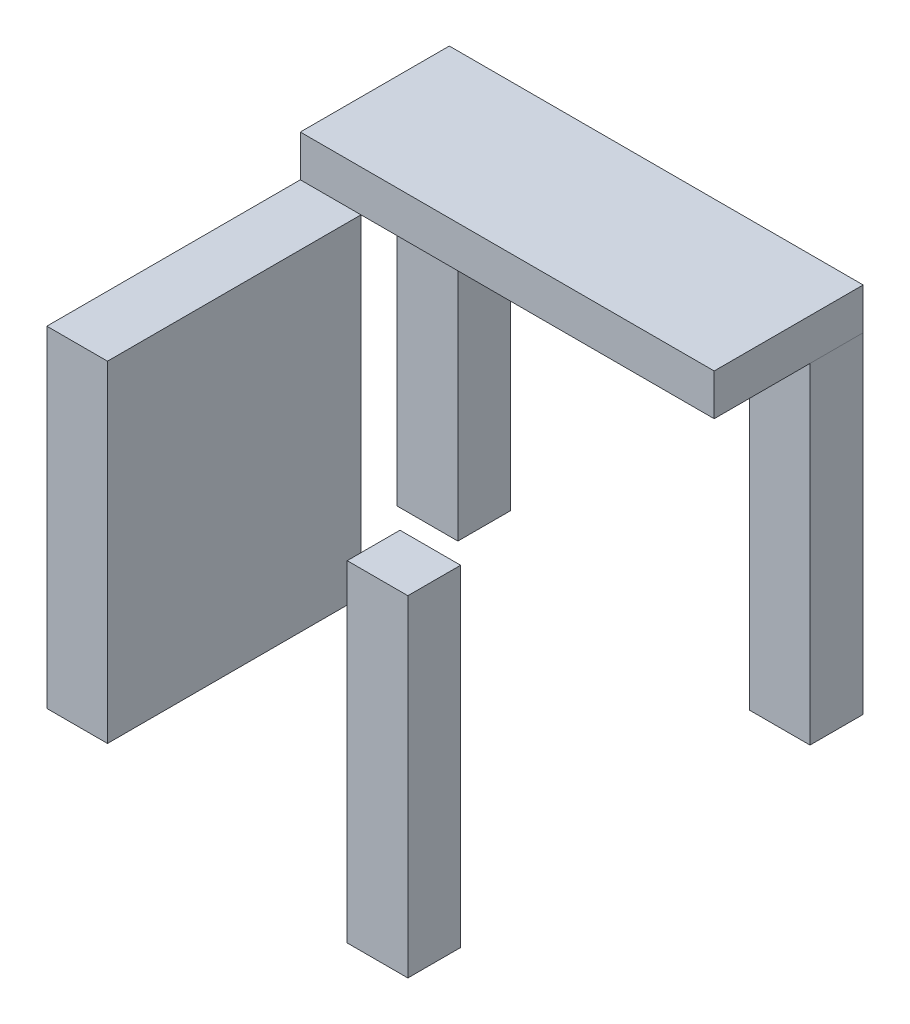
ISO-10303-21;
HEADER;
FILE_DESCRIPTION(('STEP AP214'),'2;1');
FILE_NAME('part.step','',(''),(''),'','','');
FILE_SCHEMA(('AUTOMOTIVE_DESIGN { 1 0 10303 214 1 1 1 1 }'));
ENDSEC;
DATA;
#1=APPLICATION_CONTEXT('core data for automotive mechanical design processes');
#2=APPLICATION_PROTOCOL_DEFINITION('international standard','automotive_design',2000,#1);
#3=PRODUCT_CONTEXT('',#1,'mechanical');
#4=PRODUCT('Part','Part','',(#3));
#5=PRODUCT_RELATED_PRODUCT_CATEGORY('part','',(#4));
#6=PRODUCT_DEFINITION_FORMATION('','',#4);
#7=PRODUCT_DEFINITION_CONTEXT('part definition',#1,'design');
#8=PRODUCT_DEFINITION('design','',#6,#7);
#9=PRODUCT_DEFINITION_SHAPE('','',#8);
#10=(LENGTH_UNIT() NAMED_UNIT(*) SI_UNIT(.MILLI.,.METRE.));
#11=(NAMED_UNIT(*) PLANE_ANGLE_UNIT() SI_UNIT($,.RADIAN.));
#12=(NAMED_UNIT(*) SI_UNIT($,.STERADIAN.) SOLID_ANGLE_UNIT());
#13=UNCERTAINTY_MEASURE_WITH_UNIT(LENGTH_MEASURE(1.E-05),#10,'distance_accuracy_value','');
#14=(GEOMETRIC_REPRESENTATION_CONTEXT(3) GLOBAL_UNCERTAINTY_ASSIGNED_CONTEXT((#13)) GLOBAL_UNIT_ASSIGNED_CONTEXT((#10,
#11,#12)) REPRESENTATION_CONTEXT('',''));
#15=CARTESIAN_POINT('',(0.,0.,0.));
#16=DIRECTION('',(0.,0.,1.));
#17=DIRECTION('',(1.,0.,0.));
#18=AXIS2_PLACEMENT_3D('',#15,#16,#17);
#19=CARTESIAN_POINT('',(85.36181093433,-80.,110.034688240795));
#20=DIRECTION('',(1.,0.,0.));
#21=DIRECTION('',(0.,0.,-1.));
#22=AXIS2_PLACEMENT_3D('',#19,#20,#21);
#23=PLANE('',#22);
#24=DIRECTION('',(0.,0.,-1.));
#25=VECTOR('',#24,1.);
#26=CARTESIAN_POINT('',(85.36181093433,0.,110.034688240795));
#27=LINE('',#26,#25);
#28=CARTESIAN_POINT('',(85.36181093433,0.,110.034688240795));
#29=VERTEX_POINT('',#28);
#30=CARTESIAN_POINT('',(85.36181093433,0.,97.2842820171065));
#31=VERTEX_POINT('',#30);
#32=EDGE_CURVE('E107',#29,#31,#27,.T.);
#33=ORIENTED_EDGE('',*,*,#32,.T.);
#34=DIRECTION('',(0.,1.,0.));
#35=VECTOR('',#34,1.);
#36=CARTESIAN_POINT('',(85.36181093433,-80.,97.2842820171065));
#37=LINE('',#36,#35);
#38=CARTESIAN_POINT('',(85.36181093433,-80.,97.2842820171065));
#39=VERTEX_POINT('',#38);
#40=EDGE_CURVE('E12',#39,#31,#37,.T.);
#41=ORIENTED_EDGE('',*,*,#40,.F.);
#42=DIRECTION('',(0.,0.,-1.));
#43=VECTOR('',#42,1.);
#44=CARTESIAN_POINT('',(85.36181093433,-80.,110.034688240795));
#45=LINE('',#44,#43);
#46=CARTESIAN_POINT('',(85.36181093433,-80.,110.034688240795));
#47=VERTEX_POINT('',#46);
#48=EDGE_CURVE('E95',#47,#39,#45,.T.);
#49=ORIENTED_EDGE('',*,*,#48,.F.);
#50=DIRECTION('',(0.,1.,0.));
#51=VECTOR('',#50,1.);
#52=CARTESIAN_POINT('',(85.36181093433,-80.,110.034688240795));
#53=LINE('',#52,#51);
#54=EDGE_CURVE('E103',#47,#29,#53,.T.);
#55=ORIENTED_EDGE('',*,*,#54,.T.);
#56=EDGE_LOOP('',(#33,#41,#49,#55));
#57=FACE_BOUND('',#56,.T.);
#58=ADVANCED_FACE('F44',(#57),#23,.F.);
#59=CARTESIAN_POINT('',(85.36181093433,-80.,97.2842820171065));
#60=DIRECTION('',(0.,0.,1.));
#61=DIRECTION('',(1.,0.,0.));
#62=AXIS2_PLACEMENT_3D('',#59,#60,#61);
#63=PLANE('',#62);
#64=DIRECTION('',(1.,0.,0.));
#65=VECTOR('',#64,1.);
#66=CARTESIAN_POINT('',(85.36181093433,0.,97.2842820171065));
#67=LINE('',#66,#65);
#68=CARTESIAN_POINT('',(100.019107271016,0.,97.2842820171065));
#69=VERTEX_POINT('',#68);
#70=EDGE_CURVE('E99',#31,#69,#67,.T.);
#71=ORIENTED_EDGE('',*,*,#70,.T.);
#72=DIRECTION('',(0.,1.,0.));
#73=VECTOR('',#72,1.);
#74=CARTESIAN_POINT('',(100.019107271016,-80.,97.2842820171065));
#75=LINE('',#74,#73);
#76=CARTESIAN_POINT('',(100.019107271016,-80.,97.2842820171065));
#77=VERTEX_POINT('',#76);
#78=EDGE_CURVE('E52',#77,#69,#75,.T.);
#79=ORIENTED_EDGE('',*,*,#78,.F.);
#80=DIRECTION('',(1.,0.,0.));
#81=VECTOR('',#80,1.);
#82=CARTESIAN_POINT('',(85.36181093433,-80.,97.2842820171065));
#83=LINE('',#82,#81);
#84=EDGE_CURVE('E90',#39,#77,#83,.T.);
#85=ORIENTED_EDGE('',*,*,#84,.F.);
#86=ORIENTED_EDGE('',*,*,#40,.T.);
#87=EDGE_LOOP('',(#71,#79,#85,#86));
#88=FACE_BOUND('',#87,.T.);
#89=ADVANCED_FACE('F98',(#88),#63,.F.);
#90=CARTESIAN_POINT('',(100.019107271016,-80.,110.034688240795));
#91=DIRECTION('',(-1.,0.,0.));
#92=DIRECTION('',(0.,0.,1.));
#93=AXIS2_PLACEMENT_3D('',#90,#91,#92);
#94=PLANE('',#93);
#95=DIRECTION('',(0.,0.,1.));
#96=VECTOR('',#95,1.);
#97=CARTESIAN_POINT('',(100.019107271016,0.,110.034688240795));
#98=LINE('',#97,#96);
#99=CARTESIAN_POINT('',(100.019107271016,0.,110.034688240795));
#100=VERTEX_POINT('',#99);
#101=EDGE_CURVE('E77',#69,#100,#98,.T.);
#102=ORIENTED_EDGE('',*,*,#101,.T.);
#103=DIRECTION('',(0.,1.,0.));
#104=VECTOR('',#103,1.);
#105=CARTESIAN_POINT('',(100.019107271016,-80.,110.034688240795));
#106=LINE('',#105,#104);
#107=CARTESIAN_POINT('',(100.019107271016,-80.,110.034688240795));
#108=VERTEX_POINT('',#107);
#109=EDGE_CURVE('E100',#108,#100,#106,.T.);
#110=ORIENTED_EDGE('',*,*,#109,.F.);
#111=DIRECTION('',(0.,0.,1.));
#112=VECTOR('',#111,1.);
#113=CARTESIAN_POINT('',(100.019107271016,-80.,110.034688240795));
#114=LINE('',#113,#112);
#115=EDGE_CURVE('E93',#77,#108,#114,.T.);
#116=ORIENTED_EDGE('',*,*,#115,.F.);
#117=ORIENTED_EDGE('',*,*,#78,.T.);
#118=EDGE_LOOP('',(#102,#110,#116,#117));
#119=FACE_BOUND('',#118,.T.);
#120=ADVANCED_FACE('F101',(#119),#94,.F.);
#121=CARTESIAN_POINT('',(85.36181093433,-80.,110.034688240795));
#122=DIRECTION('',(0.,0.,-1.));
#123=DIRECTION('',(-1.,0.,0.));
#124=AXIS2_PLACEMENT_3D('',#121,#122,#123);
#125=PLANE('',#124);
#126=DIRECTION('',(-1.,0.,0.));
#127=VECTOR('',#126,1.);
#128=CARTESIAN_POINT('',(85.36181093433,0.,110.034688240795));
#129=LINE('',#128,#127);
#130=EDGE_CURVE('E83',#100,#29,#129,.T.);
#131=ORIENTED_EDGE('',*,*,#130,.T.);
#132=ORIENTED_EDGE('',*,*,#54,.F.);
#133=DIRECTION('',(-1.,0.,0.));
#134=VECTOR('',#133,1.);
#135=CARTESIAN_POINT('',(85.36181093433,-80.,110.034688240795));
#136=LINE('',#135,#134);
#137=EDGE_CURVE('E60',#108,#47,#136,.T.);
#138=ORIENTED_EDGE('',*,*,#137,.F.);
#139=ORIENTED_EDGE('',*,*,#109,.T.);
#140=EDGE_LOOP('',(#131,#132,#138,#139));
#141=FACE_BOUND('',#140,.T.);
#142=ADVANCED_FACE('F114',(#141),#125,.F.);
#143=CARTESIAN_POINT('',(0.,-80.,0.));
#144=DIRECTION('',(0.,-1.,0.));
#145=DIRECTION('',(0.,0.,-1.));
#146=AXIS2_PLACEMENT_3D('',#143,#144,#145);
#147=PLANE('',#146);
#148=ORIENTED_EDGE('',*,*,#48,.T.);
#149=ORIENTED_EDGE('',*,*,#84,.T.);
#150=ORIENTED_EDGE('',*,*,#115,.T.);
#151=ORIENTED_EDGE('',*,*,#137,.T.);
#152=EDGE_LOOP('',(#148,#149,#150,#151));
#153=FACE_BOUND('',#152,.T.);
#154=ADVANCED_FACE('F91',(#153),#147,.T.);
#155=CARTESIAN_POINT('',(0.,0.,0.));
#156=DIRECTION('',(0.,-1.,0.));
#157=DIRECTION('',(0.,0.,-1.));
#158=AXIS2_PLACEMENT_3D('',#155,#156,#157);
#159=PLANE('',#158);
#160=ORIENTED_EDGE('',*,*,#32,.F.);
#161=ORIENTED_EDGE('',*,*,#130,.F.);
#162=ORIENTED_EDGE('',*,*,#101,.F.);
#163=ORIENTED_EDGE('',*,*,#70,.F.);
#164=EDGE_LOOP('',(#160,#161,#162,#163));
#165=FACE_BOUND('',#164,.T.);
#166=ADVANCED_FACE('F117',(#165),#159,.F.);
#167=CLOSED_SHELL('',(#58,#89,#120,#142,#154,#166));
#168=MANIFOLD_SOLID_BREP('B2',#167);
#169=CARTESIAN_POINT('',(0.,-80.,36.));
#170=DIRECTION('',(1.,0.,0.));
#171=DIRECTION('',(0.,0.,-1.));
#172=AXIS2_PLACEMENT_3D('',#169,#170,#171);
#173=PLANE('',#172);
#174=DIRECTION('',(0.,0.,-1.));
#175=VECTOR('',#174,1.);
#176=CARTESIAN_POINT('',(0.,0.,36.));
#177=LINE('',#176,#175);
#178=CARTESIAN_POINT('',(0.,0.,97.2495937763114));
#179=VERTEX_POINT('',#178);
#180=CARTESIAN_POINT('',(0.,0.,36.));
#181=VERTEX_POINT('',#180);
#182=EDGE_CURVE('E240',#179,#181,#177,.T.);
#183=ORIENTED_EDGE('',*,*,#182,.T.);
#184=DIRECTION('',(0.,1.,0.));
#185=VECTOR('',#184,1.);
#186=CARTESIAN_POINT('',(0.,-80.,36.));
#187=LINE('',#186,#185);
#188=CARTESIAN_POINT('',(0.,-80.,36.));
#189=VERTEX_POINT('',#188);
#190=EDGE_CURVE('E42',#189,#181,#187,.T.);
#191=ORIENTED_EDGE('',*,*,#190,.F.);
#192=DIRECTION('',(0.,0.,-1.));
#193=VECTOR('',#192,1.);
#194=CARTESIAN_POINT('',(0.,-80.,36.));
#195=LINE('',#194,#193);
#196=CARTESIAN_POINT('',(0.,-80.,97.2495937763114));
#197=VERTEX_POINT('',#196);
#198=EDGE_CURVE('E228',#197,#189,#195,.T.);
#199=ORIENTED_EDGE('',*,*,#198,.F.);
#200=DIRECTION('',(0.,1.,0.));
#201=VECTOR('',#200,1.);
#202=CARTESIAN_POINT('',(0.,-80.,97.2495937763114));
#203=LINE('',#202,#201);
#204=EDGE_CURVE('E236',#197,#179,#203,.T.);
#205=ORIENTED_EDGE('',*,*,#204,.T.);
#206=EDGE_LOOP('',(#183,#191,#199,#205));
#207=FACE_BOUND('',#206,.T.);
#208=ADVANCED_FACE('F177',(#207),#173,.F.);
#209=CARTESIAN_POINT('',(0.,-80.,36.));
#210=DIRECTION('',(0.,0.,1.));
#211=DIRECTION('',(1.,0.,0.));
#212=AXIS2_PLACEMENT_3D('',#209,#210,#211);
#213=PLANE('',#212);
#214=DIRECTION('',(1.,0.,0.));
#215=VECTOR('',#214,1.);
#216=CARTESIAN_POINT('',(0.,0.,36.));
#217=LINE('',#216,#215);
#218=CARTESIAN_POINT('',(14.6572963366857,0.,36.));
#219=VERTEX_POINT('',#218);
#220=EDGE_CURVE('E232',#181,#219,#217,.T.);
#221=ORIENTED_EDGE('',*,*,#220,.T.);
#222=DIRECTION('',(0.,1.,0.));
#223=VECTOR('',#222,1.);
#224=CARTESIAN_POINT('',(14.6572963366857,-80.,36.));
#225=LINE('',#224,#223);
#226=CARTESIAN_POINT('',(14.6572963366857,-80.,36.));
#227=VERTEX_POINT('',#226);
#228=EDGE_CURVE('E185',#227,#219,#225,.T.);
#229=ORIENTED_EDGE('',*,*,#228,.F.);
#230=DIRECTION('',(1.,0.,0.));
#231=VECTOR('',#230,1.);
#232=CARTESIAN_POINT('',(0.,-80.,36.));
#233=LINE('',#232,#231);
#234=EDGE_CURVE('E223',#189,#227,#233,.T.);
#235=ORIENTED_EDGE('',*,*,#234,.F.);
#236=ORIENTED_EDGE('',*,*,#190,.T.);
#237=EDGE_LOOP('',(#221,#229,#235,#236));
#238=FACE_BOUND('',#237,.T.);
#239=ADVANCED_FACE('F231',(#238),#213,.F.);
#240=CARTESIAN_POINT('',(14.6572963366857,-80.,36.));
#241=DIRECTION('',(-1.,0.,0.));
#242=DIRECTION('',(0.,0.,1.));
#243=AXIS2_PLACEMENT_3D('',#240,#241,#242);
#244=PLANE('',#243);
#245=DIRECTION('',(0.,0.,1.));
#246=VECTOR('',#245,1.);
#247=CARTESIAN_POINT('',(14.6572963366857,0.,36.));
#248=LINE('',#247,#246);
#249=CARTESIAN_POINT('',(14.6572963366857,0.,97.2495937763114));
#250=VERTEX_POINT('',#249);
#251=EDGE_CURVE('E210',#219,#250,#248,.T.);
#252=ORIENTED_EDGE('',*,*,#251,.T.);
#253=DIRECTION('',(0.,1.,0.));
#254=VECTOR('',#253,1.);
#255=CARTESIAN_POINT('',(14.6572963366857,-80.,97.2495937763114));
#256=LINE('',#255,#254);
#257=CARTESIAN_POINT('',(14.6572963366857,-80.,97.2495937763114));
#258=VERTEX_POINT('',#257);
#259=EDGE_CURVE('E233',#258,#250,#256,.T.);
#260=ORIENTED_EDGE('',*,*,#259,.F.);
#261=DIRECTION('',(0.,0.,1.));
#262=VECTOR('',#261,1.);
#263=CARTESIAN_POINT('',(14.6572963366857,-80.,36.));
#264=LINE('',#263,#262);
#265=EDGE_CURVE('E226',#227,#258,#264,.T.);
#266=ORIENTED_EDGE('',*,*,#265,.F.);
#267=ORIENTED_EDGE('',*,*,#228,.T.);
#268=EDGE_LOOP('',(#252,#260,#266,#267));
#269=FACE_BOUND('',#268,.T.);
#270=ADVANCED_FACE('F234',(#269),#244,.F.);
#271=CARTESIAN_POINT('',(0.,-80.,97.2495937763114));
#272=DIRECTION('',(0.,0.,-1.));
#273=DIRECTION('',(-1.,0.,0.));
#274=AXIS2_PLACEMENT_3D('',#271,#272,#273);
#275=PLANE('',#274);
#276=DIRECTION('',(-1.,0.,0.));
#277=VECTOR('',#276,1.);
#278=CARTESIAN_POINT('',(0.,0.,97.2495937763114));
#279=LINE('',#278,#277);
#280=EDGE_CURVE('E216',#250,#179,#279,.T.);
#281=ORIENTED_EDGE('',*,*,#280,.T.);
#282=ORIENTED_EDGE('',*,*,#204,.F.);
#283=DIRECTION('',(-1.,0.,0.));
#284=VECTOR('',#283,1.);
#285=CARTESIAN_POINT('',(0.,-80.,97.2495937763114));
#286=LINE('',#285,#284);
#287=EDGE_CURVE('E193',#258,#197,#286,.T.);
#288=ORIENTED_EDGE('',*,*,#287,.F.);
#289=ORIENTED_EDGE('',*,*,#259,.T.);
#290=EDGE_LOOP('',(#281,#282,#288,#289));
#291=FACE_BOUND('',#290,.T.);
#292=ADVANCED_FACE('F247',(#291),#275,.F.);
#293=CARTESIAN_POINT('',(0.,-80.,0.));
#294=DIRECTION('',(0.,1.,0.));
#295=DIRECTION('',(0.,0.,1.));
#296=AXIS2_PLACEMENT_3D('',#293,#294,#295);
#297=PLANE('',#296);
#298=ORIENTED_EDGE('',*,*,#198,.T.);
#299=ORIENTED_EDGE('',*,*,#234,.T.);
#300=ORIENTED_EDGE('',*,*,#265,.T.);
#301=ORIENTED_EDGE('',*,*,#287,.T.);
#302=EDGE_LOOP('',(#298,#299,#300,#301));
#303=FACE_BOUND('',#302,.T.);
#304=ADVANCED_FACE('F224',(#303),#297,.F.);
#305=CARTESIAN_POINT('',(0.,0.,0.));
#306=DIRECTION('',(0.,1.,0.));
#307=DIRECTION('',(0.,0.,1.));
#308=AXIS2_PLACEMENT_3D('',#305,#306,#307);
#309=PLANE('',#308);
#310=ORIENTED_EDGE('',*,*,#182,.F.);
#311=ORIENTED_EDGE('',*,*,#280,.F.);
#312=ORIENTED_EDGE('',*,*,#251,.F.);
#313=ORIENTED_EDGE('',*,*,#220,.F.);
#314=EDGE_LOOP('',(#310,#311,#312,#313));
#315=FACE_BOUND('',#314,.T.);
#316=ADVANCED_FACE('F250',(#315),#309,.T.);
#317=CLOSED_SHELL('',(#208,#239,#270,#292,#304,#316));
#318=MANIFOLD_SOLID_BREP('B6',#317);
#319=CARTESIAN_POINT('',(0.,0.,36.));
#320=DIRECTION('',(0.,1.,0.));
#321=DIRECTION('',(0.,0.,1.));
#322=AXIS2_PLACEMENT_3D('',#319,#320,#321);
#323=PLANE('',#322);
#324=DIRECTION('',(0.,0.,-1.));
#325=VECTOR('',#324,1.);
#326=CARTESIAN_POINT('',(85.2148558255428,0.,12.7157179828936));
#327=LINE('',#326,#325);
#328=CARTESIAN_POINT('',(85.2148558255428,0.,12.7157179828936));
#329=VERTEX_POINT('',#328);
#330=CARTESIAN_POINT('',(85.2148558255428,0.,0.));
#331=VERTEX_POINT('',#330);
#332=EDGE_CURVE('E318',#329,#331,#327,.T.);
#333=ORIENTED_EDGE('',*,*,#332,.F.);
#334=DIRECTION('',(-1.,0.,0.));
#335=VECTOR('',#334,1.);
#336=CARTESIAN_POINT('',(85.2148558255428,0.,12.7157179828936));
#337=LINE('',#336,#335);
#338=CARTESIAN_POINT('',(99.8721521622285,0.,12.7157179828936));
#339=VERTEX_POINT('',#338);
#340=EDGE_CURVE('E322',#339,#329,#337,.T.);
#341=ORIENTED_EDGE('',*,*,#340,.F.);
#342=DIRECTION('',(0.,0.,1.));
#343=VECTOR('',#342,1.);
#344=CARTESIAN_POINT('',(99.8721521622285,0.,12.7157179828936));
#345=LINE('',#344,#343);
#346=CARTESIAN_POINT('',(99.8721521622285,0.,0.));
#347=VERTEX_POINT('',#346);
#348=EDGE_CURVE('E647',#347,#339,#345,.T.);
#349=ORIENTED_EDGE('',*,*,#348,.F.);
#350=DIRECTION('',(1.,0.,0.));
#351=VECTOR('',#350,1.);
#352=CARTESIAN_POINT('',(0.,0.,0.));
#353=LINE('',#352,#351);
#354=CARTESIAN_POINT('',(100.,0.,0.));
#355=VERTEX_POINT('',#354);
#356=EDGE_CURVE('E478',#347,#355,#353,.T.);
#357=ORIENTED_EDGE('',*,*,#356,.T.);
#358=DIRECTION('',(0.,0.,-1.));
#359=VECTOR('',#358,1.);
#360=CARTESIAN_POINT('',(100.,0.,36.));
#361=LINE('',#360,#359);
#362=CARTESIAN_POINT('',(100.,0.,36.));
#363=VERTEX_POINT('',#362);
#364=EDGE_CURVE('E490',#363,#355,#361,.T.);
#365=ORIENTED_EDGE('',*,*,#364,.F.);
#366=DIRECTION('',(1.,0.,0.));
#367=VECTOR('',#366,1.);
#368=CARTESIAN_POINT('',(0.,0.,36.));
#369=LINE('',#368,#367);
#370=CARTESIAN_POINT('',(0.,0.,36.));
#371=VERTEX_POINT('',#370);
#372=EDGE_CURVE('E468',#371,#363,#369,.T.);
#373=ORIENTED_EDGE('',*,*,#372,.F.);
#374=DIRECTION('',(0.,0.,-1.));
#375=VECTOR('',#374,1.);
#376=CARTESIAN_POINT('',(0.,0.,36.));
#377=LINE('',#376,#375);
#378=CARTESIAN_POINT('',(0.,0.,12.5687628741064));
#379=VERTEX_POINT('',#378);
#380=EDGE_CURVE('E305',#371,#379,#377,.T.);
#381=ORIENTED_EDGE('',*,*,#380,.T.);
#382=DIRECTION('',(-1.,0.,0.));
#383=VECTOR('',#382,1.);
#384=CARTESIAN_POINT('',(-0.0191072710157194,0.,12.5687628741064));
#385=LINE('',#384,#383);
#386=CARTESIAN_POINT('',(14.63818906567,0.,12.5687628741064));
#387=VERTEX_POINT('',#386);
#388=EDGE_CURVE('E441',#387,#379,#385,.T.);
#389=ORIENTED_EDGE('',*,*,#388,.F.);
#390=DIRECTION('',(0.,0.,1.));
#391=VECTOR('',#390,1.);
#392=CARTESIAN_POINT('',(14.63818906567,0.,12.5687628741064));
#393=LINE('',#392,#391);
#394=CARTESIAN_POINT('',(14.63818906567,0.,0.));
#395=VERTEX_POINT('',#394);
#396=EDGE_CURVE('E175',#395,#387,#393,.T.);
#397=ORIENTED_EDGE('',*,*,#396,.F.);
#398=EDGE_CURVE('E483',#395,#331,#353,.T.);
#399=ORIENTED_EDGE('',*,*,#398,.T.);
#400=EDGE_LOOP('',(#333,#341,#349,#357,#365,#373,#381,#389,#397,#399));
#401=FACE_BOUND('',#400,.T.);
#402=ADVANCED_FACE('F301',(#401),#323,.F.);
#403=CARTESIAN_POINT('',(0.,0.,36.));
#404=DIRECTION('',(1.,0.,0.));
#405=DIRECTION('',(0.,0.,-1.));
#406=AXIS2_PLACEMENT_3D('',#403,#404,#405);
#407=PLANE('',#406);
#408=DIRECTION('',(0.,-1.,0.));
#409=VECTOR('',#408,1.);
#410=CARTESIAN_POINT('',(0.,0.,0.));
#411=LINE('',#410,#409);
#412=CARTESIAN_POINT('',(0.,10.,0.));
#413=VERTEX_POINT('',#412);
#414=CARTESIAN_POINT('',(0.,0.,0.));
#415=VERTEX_POINT('',#414);
#416=EDGE_CURVE('E464',#413,#415,#411,.T.);
#417=ORIENTED_EDGE('',*,*,#416,.T.);
#418=EDGE_CURVE('E492',#379,#415,#377,.T.);
#419=ORIENTED_EDGE('',*,*,#418,.F.);
#420=ORIENTED_EDGE('',*,*,#380,.F.);
#421=DIRECTION('',(0.,-1.,0.));
#422=VECTOR('',#421,1.);
#423=CARTESIAN_POINT('',(0.,0.,36.));
#424=LINE('',#423,#422);
#425=CARTESIAN_POINT('',(0.,10.,36.));
#426=VERTEX_POINT('',#425);
#427=EDGE_CURVE('E465',#426,#371,#424,.T.);
#428=ORIENTED_EDGE('',*,*,#427,.F.);
#429=DIRECTION('',(0.,0.,-1.));
#430=VECTOR('',#429,1.);
#431=CARTESIAN_POINT('',(0.,10.,36.));
#432=LINE('',#431,#430);
#433=EDGE_CURVE('E475',#426,#413,#432,.T.);
#434=ORIENTED_EDGE('',*,*,#433,.T.);
#435=EDGE_LOOP('',(#417,#419,#420,#428,#434));
#436=FACE_BOUND('',#435,.T.);
#437=ADVANCED_FACE('F303',(#436),#407,.F.);
#438=CARTESIAN_POINT('',(100.,0.,36.));
#439=DIRECTION('',(-1.,0.,0.));
#440=DIRECTION('',(0.,0.,1.));
#441=AXIS2_PLACEMENT_3D('',#438,#439,#440);
#442=PLANE('',#441);
#443=DIRECTION('',(0.,1.,0.));
#444=VECTOR('',#443,1.);
#445=CARTESIAN_POINT('',(100.,0.,0.));
#446=LINE('',#445,#444);
#447=CARTESIAN_POINT('',(100.,10.,0.));
#448=VERTEX_POINT('',#447);
#449=EDGE_CURVE('E482',#355,#448,#446,.T.);
#450=ORIENTED_EDGE('',*,*,#449,.T.);
#451=DIRECTION('',(0.,0.,-1.));
#452=VECTOR('',#451,1.);
#453=CARTESIAN_POINT('',(100.,10.,36.));
#454=LINE('',#453,#452);
#455=CARTESIAN_POINT('',(100.,10.,36.));
#456=VERTEX_POINT('',#455);
#457=EDGE_CURVE('E488',#456,#448,#454,.T.);
#458=ORIENTED_EDGE('',*,*,#457,.F.);
#459=DIRECTION('',(0.,1.,0.));
#460=VECTOR('',#459,1.);
#461=CARTESIAN_POINT('',(100.,0.,36.));
#462=LINE('',#461,#460);
#463=EDGE_CURVE('E471',#363,#456,#462,.T.);
#464=ORIENTED_EDGE('',*,*,#463,.F.);
#465=ORIENTED_EDGE('',*,*,#364,.T.);
#466=EDGE_LOOP('',(#450,#458,#464,#465));
#467=FACE_BOUND('',#466,.T.);
#468=ADVANCED_FACE('F543',(#467),#442,.F.);
#469=CARTESIAN_POINT('',(0.,10.,36.));
#470=DIRECTION('',(0.,-1.,0.));
#471=DIRECTION('',(0.,0.,-1.));
#472=AXIS2_PLACEMENT_3D('',#469,#470,#471);
#473=PLANE('',#472);
#474=DIRECTION('',(-1.,0.,0.));
#475=VECTOR('',#474,1.);
#476=CARTESIAN_POINT('',(0.,10.,0.));
#477=LINE('',#476,#475);
#478=EDGE_CURVE('E469',#448,#413,#477,.T.);
#479=ORIENTED_EDGE('',*,*,#478,.T.);
#480=ORIENTED_EDGE('',*,*,#433,.F.);
#481=DIRECTION('',(-1.,0.,0.));
#482=VECTOR('',#481,1.);
#483=CARTESIAN_POINT('',(0.,10.,36.));
#484=LINE('',#483,#482);
#485=EDGE_CURVE('E473',#456,#426,#484,.T.);
#486=ORIENTED_EDGE('',*,*,#485,.F.);
#487=ORIENTED_EDGE('',*,*,#457,.T.);
#488=EDGE_LOOP('',(#479,#480,#486,#487));
#489=FACE_BOUND('',#488,.T.);
#490=ADVANCED_FACE('F547',(#489),#473,.F.);
#491=CARTESIAN_POINT('',(0.,0.,36.));
#492=DIRECTION('',(0.,0.,-1.));
#493=DIRECTION('',(-1.,0.,0.));
#494=AXIS2_PLACEMENT_3D('',#491,#492,#493);
#495=PLANE('',#494);
#496=ORIENTED_EDGE('',*,*,#427,.T.);
#497=ORIENTED_EDGE('',*,*,#372,.T.);
#498=ORIENTED_EDGE('',*,*,#463,.T.);
#499=ORIENTED_EDGE('',*,*,#485,.T.);
#500=EDGE_LOOP('',(#496,#497,#498,#499));
#501=FACE_BOUND('',#500,.T.);
#502=ADVANCED_FACE('F550',(#501),#495,.F.);
#503=CARTESIAN_POINT('',(0.,0.,0.));
#504=DIRECTION('',(0.,0.,-1.));
#505=DIRECTION('',(-1.,0.,0.));
#506=AXIS2_PLACEMENT_3D('',#503,#504,#505);
#507=PLANE('',#506);
#508=ORIENTED_EDGE('',*,*,#416,.F.);
#509=ORIENTED_EDGE('',*,*,#478,.F.);
#510=ORIENTED_EDGE('',*,*,#449,.F.);
#511=ORIENTED_EDGE('',*,*,#356,.F.);
#512=EDGE_CURVE('E520',#331,#347,#353,.T.);
#513=ORIENTED_EDGE('',*,*,#512,.F.);
#514=ORIENTED_EDGE('',*,*,#398,.F.);
#515=EDGE_CURVE('E479',#415,#395,#353,.T.);
#516=ORIENTED_EDGE('',*,*,#515,.F.);
#517=EDGE_LOOP('',(#508,#509,#510,#511,#513,#514,#516));
#518=FACE_BOUND('',#517,.T.);
#519=ADVANCED_FACE('F518',(#518),#507,.T.);
#520=CARTESIAN_POINT('',(0.,0.,0.));
#521=DIRECTION('',(0.,-1.,0.));
#522=DIRECTION('',(0.,0.,-1.));
#523=AXIS2_PLACEMENT_3D('',#520,#521,#522);
#524=PLANE('',#523);
#525=ORIENTED_EDGE('',*,*,#418,.T.);
#526=ORIENTED_EDGE('',*,*,#515,.T.);
#527=CARTESIAN_POINT('',(14.63818906567,0.,-0.181643349582247));
#528=VERTEX_POINT('',#527);
#529=EDGE_CURVE('E311',#528,#395,#393,.T.);
#530=ORIENTED_EDGE('',*,*,#529,.F.);
#531=DIRECTION('',(1.,0.,0.));
#532=VECTOR('',#531,1.);
#533=CARTESIAN_POINT('',(-0.0191072710157177,0.,-0.181643349582247));
#534=LINE('',#533,#532);
#535=CARTESIAN_POINT('',(-0.0191072710157177,0.,-0.181643349582247));
#536=VERTEX_POINT('',#535);
#537=EDGE_CURVE('E431',#536,#528,#534,.T.);
#538=ORIENTED_EDGE('',*,*,#537,.F.);
#539=DIRECTION('',(0.,0.,-1.));
#540=VECTOR('',#539,1.);
#541=CARTESIAN_POINT('',(-0.0191072710157194,0.,12.5687628741064));
#542=LINE('',#541,#540);
#543=CARTESIAN_POINT('',(-0.0191072710157194,0.,12.5687628741064));
#544=VERTEX_POINT('',#543);
#545=EDGE_CURVE('E428',#544,#536,#542,.T.);
#546=ORIENTED_EDGE('',*,*,#545,.F.);
#547=EDGE_CURVE('E450',#379,#544,#385,.T.);
#548=ORIENTED_EDGE('',*,*,#547,.F.);
#549=EDGE_LOOP('',(#525,#526,#530,#538,#546,#548));
#550=FACE_BOUND('',#549,.T.);
#551=ADVANCED_FACE('F505',(#550),#524,.F.);
#552=CARTESIAN_POINT('',(-0.0191072710157194,-80.,12.5687628741064));
#553=DIRECTION('',(1.,0.,0.));
#554=DIRECTION('',(0.,0.,-1.));
#555=AXIS2_PLACEMENT_3D('',#552,#553,#554);
#556=PLANE('',#555);
#557=ORIENTED_EDGE('',*,*,#545,.T.);
#558=DIRECTION('',(0.,1.,0.));
#559=VECTOR('',#558,1.);
#560=CARTESIAN_POINT('',(-0.0191072710157177,-80.,-0.181643349582247));
#561=LINE('',#560,#559);
#562=CARTESIAN_POINT('',(-0.0191072710157177,-80.,-0.181643349582247));
#563=VERTEX_POINT('',#562);
#564=EDGE_CURVE('E461',#563,#536,#561,.T.);
#565=ORIENTED_EDGE('',*,*,#564,.F.);
#566=DIRECTION('',(0.,0.,-1.));
#567=VECTOR('',#566,1.);
#568=CARTESIAN_POINT('',(-0.0191072710157194,-80.,12.5687628741064));
#569=LINE('',#568,#567);
#570=CARTESIAN_POINT('',(-0.0191072710157194,-80.,12.5687628741064));
#571=VERTEX_POINT('',#570);
#572=EDGE_CURVE('E437',#571,#563,#569,.T.);
#573=ORIENTED_EDGE('',*,*,#572,.F.);
#574=DIRECTION('',(0.,1.,0.));
#575=VECTOR('',#574,1.);
#576=CARTESIAN_POINT('',(-0.0191072710157194,-80.,12.5687628741064));
#577=LINE('',#576,#575);
#578=EDGE_CURVE('E446',#571,#544,#577,.T.);
#579=ORIENTED_EDGE('',*,*,#578,.T.);
#580=EDGE_LOOP('',(#557,#565,#573,#579));
#581=FACE_BOUND('',#580,.T.);
#582=ADVANCED_FACE('F527',(#581),#556,.F.);
#583=CARTESIAN_POINT('',(-0.0191072710157177,-80.,-0.181643349582247));
#584=DIRECTION('',(0.,0.,1.));
#585=DIRECTION('',(1.,0.,0.));
#586=AXIS2_PLACEMENT_3D('',#583,#584,#585);
#587=PLANE('',#586);
#588=ORIENTED_EDGE('',*,*,#537,.T.);
#589=DIRECTION('',(0.,1.,0.));
#590=VECTOR('',#589,1.);
#591=CARTESIAN_POINT('',(14.63818906567,-80.,-0.181643349582247));
#592=LINE('',#591,#590);
#593=CARTESIAN_POINT('',(14.63818906567,-80.,-0.181643349582247));
#594=VERTEX_POINT('',#593);
#595=EDGE_CURVE('E458',#594,#528,#592,.T.);
#596=ORIENTED_EDGE('',*,*,#595,.F.);
#597=DIRECTION('',(1.,0.,0.));
#598=VECTOR('',#597,1.);
#599=CARTESIAN_POINT('',(-0.0191072710157177,-80.,-0.181643349582247));
#600=LINE('',#599,#598);
#601=EDGE_CURVE('E440',#563,#594,#600,.T.);
#602=ORIENTED_EDGE('',*,*,#601,.F.);
#603=ORIENTED_EDGE('',*,*,#564,.T.);
#604=EDGE_LOOP('',(#588,#596,#602,#603));
#605=FACE_BOUND('',#604,.T.);
#606=ADVANCED_FACE('F524',(#605),#587,.F.);
#607=CARTESIAN_POINT('',(14.63818906567,-80.,12.5687628741064));
#608=DIRECTION('',(-1.,0.,0.));
#609=DIRECTION('',(0.,0.,1.));
#610=AXIS2_PLACEMENT_3D('',#607,#608,#609);
#611=PLANE('',#610);
#612=ORIENTED_EDGE('',*,*,#529,.T.);
#613=ORIENTED_EDGE('',*,*,#396,.T.);
#614=DIRECTION('',(0.,1.,0.));
#615=VECTOR('',#614,1.);
#616=CARTESIAN_POINT('',(14.63818906567,-80.,12.5687628741064));
#617=LINE('',#616,#615);
#618=CARTESIAN_POINT('',(14.63818906567,-80.,12.5687628741064));
#619=VERTEX_POINT('',#618);
#620=EDGE_CURVE('E455',#619,#387,#617,.T.);
#621=ORIENTED_EDGE('',*,*,#620,.F.);
#622=DIRECTION('',(0.,0.,1.));
#623=VECTOR('',#622,1.);
#624=CARTESIAN_POINT('',(14.63818906567,-80.,12.5687628741064));
#625=LINE('',#624,#623);
#626=EDGE_CURVE('E443',#594,#619,#625,.T.);
#627=ORIENTED_EDGE('',*,*,#626,.F.);
#628=ORIENTED_EDGE('',*,*,#595,.T.);
#629=EDGE_LOOP('',(#612,#613,#621,#627,#628));
#630=FACE_BOUND('',#629,.T.);
#631=ADVANCED_FACE('F513',(#630),#611,.F.);
#632=CARTESIAN_POINT('',(-0.0191072710157194,-80.,12.5687628741064));
#633=DIRECTION('',(0.,0.,-1.));
#634=DIRECTION('',(-1.,0.,0.));
#635=AXIS2_PLACEMENT_3D('',#632,#633,#634);
#636=PLANE('',#635);
#637=ORIENTED_EDGE('',*,*,#388,.T.);
#638=ORIENTED_EDGE('',*,*,#547,.T.);
#639=ORIENTED_EDGE('',*,*,#578,.F.);
#640=DIRECTION('',(-1.,0.,0.));
#641=VECTOR('',#640,1.);
#642=CARTESIAN_POINT('',(-0.0191072710157194,-80.,12.5687628741064));
#643=LINE('',#642,#641);
#644=EDGE_CURVE('E445',#619,#571,#643,.T.);
#645=ORIENTED_EDGE('',*,*,#644,.F.);
#646=ORIENTED_EDGE('',*,*,#620,.T.);
#647=EDGE_LOOP('',(#637,#638,#639,#645,#646));
#648=FACE_BOUND('',#647,.T.);
#649=ADVANCED_FACE('F508',(#648),#636,.F.);
#650=CARTESIAN_POINT('',(0.,-80.,0.));
#651=DIRECTION('',(0.,-1.,0.));
#652=DIRECTION('',(0.,0.,-1.));
#653=AXIS2_PLACEMENT_3D('',#650,#651,#652);
#654=PLANE('',#653);
#655=ORIENTED_EDGE('',*,*,#572,.T.);
#656=ORIENTED_EDGE('',*,*,#601,.T.);
#657=ORIENTED_EDGE('',*,*,#626,.T.);
#658=ORIENTED_EDGE('',*,*,#644,.T.);
#659=EDGE_LOOP('',(#655,#656,#657,#658));
#660=FACE_BOUND('',#659,.T.);
#661=ADVANCED_FACE('F529',(#660),#654,.T.);
#662=CARTESIAN_POINT('',(85.2148558255428,-80.,12.7157179828936));
#663=DIRECTION('',(1.,0.,0.));
#664=DIRECTION('',(0.,0.,-1.));
#665=AXIS2_PLACEMENT_3D('',#662,#663,#664);
#666=PLANE('',#665);
#667=ORIENTED_EDGE('',*,*,#332,.T.);
#668=CARTESIAN_POINT('',(85.2148558255428,0.,-0.0346882407950694));
#669=VERTEX_POINT('',#668);
#670=EDGE_CURVE('E426',#331,#669,#327,.T.);
#671=ORIENTED_EDGE('',*,*,#670,.T.);
#672=DIRECTION('',(0.,1.,0.));
#673=VECTOR('',#672,1.);
#674=CARTESIAN_POINT('',(85.2148558255428,-80.,-0.0346882407950694));
#675=LINE('',#674,#673);
#676=CARTESIAN_POINT('',(85.2148558255428,-80.,-0.0346882407950694));
#677=VERTEX_POINT('',#676);
#678=EDGE_CURVE('E408',#677,#669,#675,.T.);
#679=ORIENTED_EDGE('',*,*,#678,.F.);
#680=DIRECTION('',(0.,0.,-1.));
#681=VECTOR('',#680,1.);
#682=CARTESIAN_POINT('',(85.2148558255428,-80.,12.7157179828936));
#683=LINE('',#682,#681);
#684=CARTESIAN_POINT('',(85.2148558255428,-80.,12.7157179828936));
#685=VERTEX_POINT('',#684);
#686=EDGE_CURVE('E414',#685,#677,#683,.T.);
#687=ORIENTED_EDGE('',*,*,#686,.F.);
#688=DIRECTION('',(0.,1.,0.));
#689=VECTOR('',#688,1.);
#690=CARTESIAN_POINT('',(85.2148558255428,-80.,12.7157179828936));
#691=LINE('',#690,#689);
#692=EDGE_CURVE('E655',#685,#329,#691,.T.);
#693=ORIENTED_EDGE('',*,*,#692,.T.);
#694=EDGE_LOOP('',(#667,#671,#679,#687,#693));
#695=FACE_BOUND('',#694,.T.);
#696=ADVANCED_FACE('F424',(#695),#666,.F.);
#697=CARTESIAN_POINT('',(85.2148558255428,-80.,-0.0346882407950694));
#698=DIRECTION('',(0.,0.,1.));
#699=DIRECTION('',(1.,0.,0.));
#700=AXIS2_PLACEMENT_3D('',#697,#698,#699);
#701=PLANE('',#700);
#702=DIRECTION('',(1.,0.,0.));
#703=VECTOR('',#702,1.);
#704=CARTESIAN_POINT('',(85.2148558255428,0.,-0.0346882407950694));
#705=LINE('',#704,#703);
#706=CARTESIAN_POINT('',(99.8721521622285,0.,-0.0346882407950694));
#707=VERTEX_POINT('',#706);
#708=EDGE_CURVE('E651',#669,#707,#705,.T.);
#709=ORIENTED_EDGE('',*,*,#708,.T.);
#710=DIRECTION('',(0.,1.,0.));
#711=VECTOR('',#710,1.);
#712=CARTESIAN_POINT('',(99.8721521622285,-80.,-0.0346882407950694));
#713=LINE('',#712,#711);
#714=CARTESIAN_POINT('',(99.8721521622285,-80.,-0.0346882407950694));
#715=VERTEX_POINT('',#714);
#716=EDGE_CURVE('E410',#715,#707,#713,.T.);
#717=ORIENTED_EDGE('',*,*,#716,.F.);
#718=DIRECTION('',(1.,0.,0.));
#719=VECTOR('',#718,1.);
#720=CARTESIAN_POINT('',(85.2148558255428,-80.,-0.0346882407950694));
#721=LINE('',#720,#719);
#722=EDGE_CURVE('E404',#677,#715,#721,.T.);
#723=ORIENTED_EDGE('',*,*,#722,.F.);
#724=ORIENTED_EDGE('',*,*,#678,.T.);
#725=EDGE_LOOP('',(#709,#717,#723,#724));
#726=FACE_BOUND('',#725,.T.);
#727=ADVANCED_FACE('F406',(#726),#701,.F.);
#728=CARTESIAN_POINT('',(99.8721521622285,-80.,12.7157179828936));
#729=DIRECTION('',(-1.,0.,0.));
#730=DIRECTION('',(0.,0.,1.));
#731=AXIS2_PLACEMENT_3D('',#728,#729,#730);
#732=PLANE('',#731);
#733=EDGE_CURVE('E645',#707,#347,#345,.T.);
#734=ORIENTED_EDGE('',*,*,#733,.T.);
#735=ORIENTED_EDGE('',*,*,#348,.T.);
#736=DIRECTION('',(0.,1.,0.));
#737=VECTOR('',#736,1.);
#738=CARTESIAN_POINT('',(99.8721521622285,-80.,12.7157179828936));
#739=LINE('',#738,#737);
#740=CARTESIAN_POINT('',(99.8721521622285,-80.,12.7157179828936));
#741=VERTEX_POINT('',#740);
#742=EDGE_CURVE('E433',#741,#339,#739,.T.);
#743=ORIENTED_EDGE('',*,*,#742,.F.);
#744=DIRECTION('',(0.,0.,1.));
#745=VECTOR('',#744,1.);
#746=CARTESIAN_POINT('',(99.8721521622285,-80.,12.7157179828936));
#747=LINE('',#746,#745);
#748=EDGE_CURVE('E413',#715,#741,#747,.T.);
#749=ORIENTED_EDGE('',*,*,#748,.F.);
#750=ORIENTED_EDGE('',*,*,#716,.T.);
#751=EDGE_LOOP('',(#734,#735,#743,#749,#750));
#752=FACE_BOUND('',#751,.T.);
#753=ADVANCED_FACE('F602',(#752),#732,.F.);
#754=CARTESIAN_POINT('',(85.2148558255428,-80.,12.7157179828936));
#755=DIRECTION('',(0.,0.,-1.));
#756=DIRECTION('',(-1.,0.,0.));
#757=AXIS2_PLACEMENT_3D('',#754,#755,#756);
#758=PLANE('',#757);
#759=ORIENTED_EDGE('',*,*,#340,.T.);
#760=ORIENTED_EDGE('',*,*,#692,.F.);
#761=DIRECTION('',(-1.,0.,0.));
#762=VECTOR('',#761,1.);
#763=CARTESIAN_POINT('',(85.2148558255428,-80.,12.7157179828936));
#764=LINE('',#763,#762);
#765=EDGE_CURVE('E419',#741,#685,#764,.T.);
#766=ORIENTED_EDGE('',*,*,#765,.F.);
#767=ORIENTED_EDGE('',*,*,#742,.T.);
#768=EDGE_LOOP('',(#759,#760,#766,#767));
#769=FACE_BOUND('',#768,.T.);
#770=ADVANCED_FACE('F611',(#769),#758,.F.);
#771=CARTESIAN_POINT('',(0.,-80.,0.));
#772=DIRECTION('',(0.,-1.,0.));
#773=DIRECTION('',(0.,0.,-1.));
#774=AXIS2_PLACEMENT_3D('',#771,#772,#773);
#775=PLANE('',#774);
#776=ORIENTED_EDGE('',*,*,#686,.T.);
#777=ORIENTED_EDGE('',*,*,#722,.T.);
#778=ORIENTED_EDGE('',*,*,#748,.T.);
#779=ORIENTED_EDGE('',*,*,#765,.T.);
#780=EDGE_LOOP('',(#776,#777,#778,#779));
#781=FACE_BOUND('',#780,.T.);
#782=ADVANCED_FACE('F417',(#781),#775,.T.);
#783=CARTESIAN_POINT('',(0.,0.,0.));
#784=DIRECTION('',(0.,-1.,0.));
#785=DIRECTION('',(0.,0.,-1.));
#786=AXIS2_PLACEMENT_3D('',#783,#784,#785);
#787=PLANE('',#786);
#788=ORIENTED_EDGE('',*,*,#512,.T.);
#789=ORIENTED_EDGE('',*,*,#733,.F.);
#790=ORIENTED_EDGE('',*,*,#708,.F.);
#791=ORIENTED_EDGE('',*,*,#670,.F.);
#792=EDGE_LOOP('',(#788,#789,#790,#791));
#793=FACE_BOUND('',#792,.T.);
#794=ADVANCED_FACE('F630',(#793),#787,.F.);
#795=CLOSED_SHELL('',(#402,#437,#468,#490,#502,#519,#551,#582,#606,#631,#649,#661,#696,#727,
#753,#770,#782,#794));
#796=MANIFOLD_SOLID_BREP('B36',#795);
#797=ADVANCED_BREP_SHAPE_REPRESENTATION('',(#18,#168,#318,#796),#14);
#798=SHAPE_DEFINITION_REPRESENTATION(#9,#797);
ENDSEC;
END-ISO-10303-21;
